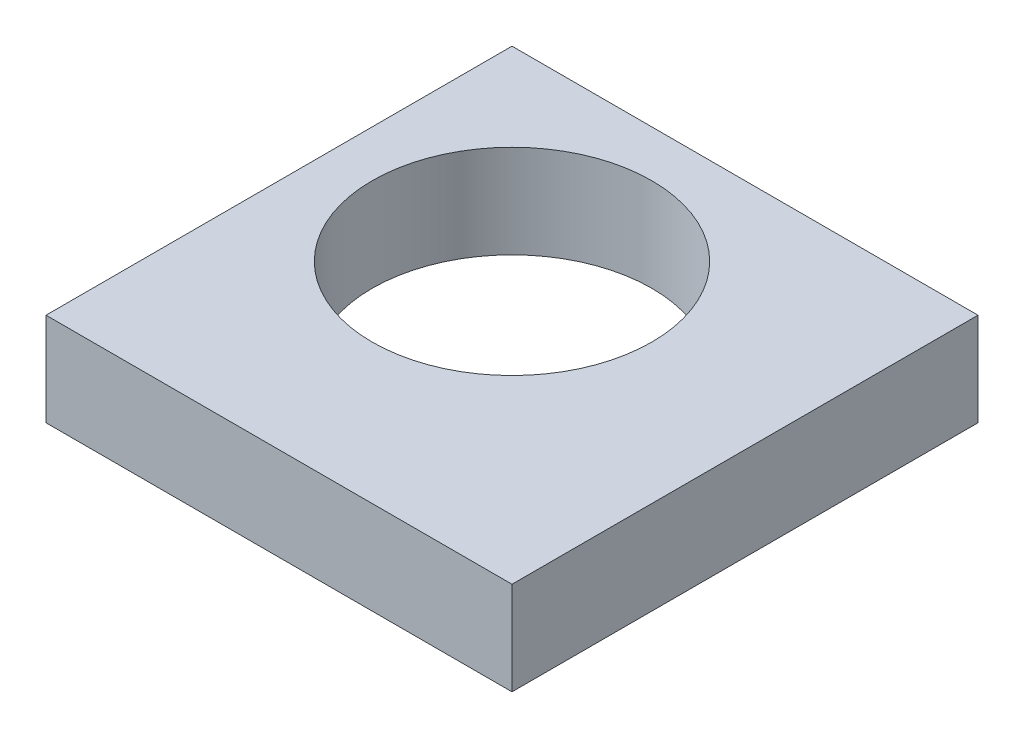
ISO-10303-21;
HEADER;
FILE_DESCRIPTION(('STEP AP214'),'2;1');
FILE_NAME('part.step','',(''),(''),'','','');
FILE_SCHEMA(('AUTOMOTIVE_DESIGN { 1 0 10303 214 1 1 1 1 }'));
ENDSEC;
DATA;
#1=APPLICATION_CONTEXT('core data for automotive mechanical design processes');
#2=APPLICATION_PROTOCOL_DEFINITION('international standard','automotive_design',2000,#1);
#3=PRODUCT_CONTEXT('',#1,'mechanical');
#4=PRODUCT('Part','Part','',(#3));
#5=PRODUCT_RELATED_PRODUCT_CATEGORY('part','',(#4));
#6=PRODUCT_DEFINITION_FORMATION('','',#4);
#7=PRODUCT_DEFINITION_CONTEXT('part definition',#1,'design');
#8=PRODUCT_DEFINITION('design','',#6,#7);
#9=PRODUCT_DEFINITION_SHAPE('','',#8);
#10=(LENGTH_UNIT() NAMED_UNIT(*) SI_UNIT(.MILLI.,.METRE.));
#11=(NAMED_UNIT(*) PLANE_ANGLE_UNIT() SI_UNIT($,.RADIAN.));
#12=(NAMED_UNIT(*) SI_UNIT($,.STERADIAN.) SOLID_ANGLE_UNIT());
#13=UNCERTAINTY_MEASURE_WITH_UNIT(LENGTH_MEASURE(1.E-05),#10,'distance_accuracy_value','');
#14=(GEOMETRIC_REPRESENTATION_CONTEXT(3) GLOBAL_UNCERTAINTY_ASSIGNED_CONTEXT((#13)) GLOBAL_UNIT_ASSIGNED_CONTEXT((#10,
#11,#12)) REPRESENTATION_CONTEXT('',''));
#15=CARTESIAN_POINT('',(0.,0.,0.));
#16=DIRECTION('',(0.,0.,1.));
#17=DIRECTION('',(1.,0.,0.));
#18=AXIS2_PLACEMENT_3D('',#15,#16,#17);
#19=CARTESIAN_POINT('',(-25.,10.,-25.));
#20=DIRECTION('',(1.,0.,0.));
#21=DIRECTION('',(0.,0.,-1.));
#22=AXIS2_PLACEMENT_3D('',#19,#20,#21);
#23=PLANE('',#22);
#24=DIRECTION('',(0.,0.,1.));
#25=VECTOR('',#24,1.);
#26=CARTESIAN_POINT('',(-25.,0.,-25.));
#27=LINE('',#26,#25);
#28=CARTESIAN_POINT('',(-25.,0.,-25.));
#29=VERTEX_POINT('',#28);
#30=CARTESIAN_POINT('',(-25.,0.,25.));
#31=VERTEX_POINT('',#30);
#32=EDGE_CURVE('E100',#29,#31,#27,.T.);
#33=ORIENTED_EDGE('',*,*,#32,.T.);
#34=DIRECTION('',(0.,-1.,0.));
#35=VECTOR('',#34,1.);
#36=CARTESIAN_POINT('',(-25.,10.,25.));
#37=LINE('',#36,#35);
#38=CARTESIAN_POINT('',(-25.,10.,25.));
#39=VERTEX_POINT('',#38);
#40=EDGE_CURVE('E11',#39,#31,#37,.T.);
#41=ORIENTED_EDGE('',*,*,#40,.F.);
#42=DIRECTION('',(0.,0.,1.));
#43=VECTOR('',#42,1.);
#44=CARTESIAN_POINT('',(-25.,10.,-25.));
#45=LINE('',#44,#43);
#46=CARTESIAN_POINT('',(-25.,10.,-25.));
#47=VERTEX_POINT('',#46);
#48=EDGE_CURVE('E88',#47,#39,#45,.T.);
#49=ORIENTED_EDGE('',*,*,#48,.F.);
#50=DIRECTION('',(0.,-1.,0.));
#51=VECTOR('',#50,1.);
#52=CARTESIAN_POINT('',(-25.,10.,-25.));
#53=LINE('',#52,#51);
#54=EDGE_CURVE('E96',#47,#29,#53,.T.);
#55=ORIENTED_EDGE('',*,*,#54,.T.);
#56=EDGE_LOOP('',(#33,#41,#49,#55));
#57=FACE_BOUND('',#56,.T.);
#58=ADVANCED_FACE('F37',(#57),#23,.F.);
#59=CARTESIAN_POINT('',(25.,10.,25.));
#60=DIRECTION('',(0.,0.,-1.));
#61=DIRECTION('',(-1.,0.,0.));
#62=AXIS2_PLACEMENT_3D('',#59,#60,#61);
#63=PLANE('',#62);
#64=DIRECTION('',(1.,0.,0.));
#65=VECTOR('',#64,1.);
#66=CARTESIAN_POINT('',(25.,0.,25.));
#67=LINE('',#66,#65);
#68=CARTESIAN_POINT('',(25.,0.,25.));
#69=VERTEX_POINT('',#68);
#70=EDGE_CURVE('E92',#31,#69,#67,.T.);
#71=ORIENTED_EDGE('',*,*,#70,.T.);
#72=DIRECTION('',(0.,-1.,0.));
#73=VECTOR('',#72,1.);
#74=CARTESIAN_POINT('',(25.,10.,25.));
#75=LINE('',#74,#73);
#76=CARTESIAN_POINT('',(25.,10.,25.));
#77=VERTEX_POINT('',#76);
#78=EDGE_CURVE('E45',#77,#69,#75,.T.);
#79=ORIENTED_EDGE('',*,*,#78,.F.);
#80=DIRECTION('',(1.,0.,0.));
#81=VECTOR('',#80,1.);
#82=CARTESIAN_POINT('',(25.,10.,25.));
#83=LINE('',#82,#81);
#84=EDGE_CURVE('E83',#39,#77,#83,.T.);
#85=ORIENTED_EDGE('',*,*,#84,.F.);
#86=ORIENTED_EDGE('',*,*,#40,.T.);
#87=EDGE_LOOP('',(#71,#79,#85,#86));
#88=FACE_BOUND('',#87,.T.);
#89=ADVANCED_FACE('F91',(#88),#63,.F.);
#90=CARTESIAN_POINT('',(25.,10.,-25.));
#91=DIRECTION('',(-1.,0.,0.));
#92=DIRECTION('',(0.,0.,1.));
#93=AXIS2_PLACEMENT_3D('',#90,#91,#92);
#94=PLANE('',#93);
#95=DIRECTION('',(0.,0.,-1.));
#96=VECTOR('',#95,1.);
#97=CARTESIAN_POINT('',(25.,0.,-25.));
#98=LINE('',#97,#96);
#99=CARTESIAN_POINT('',(25.,0.,-25.));
#100=VERTEX_POINT('',#99);
#101=EDGE_CURVE('E70',#69,#100,#98,.T.);
#102=ORIENTED_EDGE('',*,*,#101,.T.);
#103=DIRECTION('',(0.,-1.,0.));
#104=VECTOR('',#103,1.);
#105=CARTESIAN_POINT('',(25.,10.,-25.));
#106=LINE('',#105,#104);
#107=CARTESIAN_POINT('',(25.,10.,-25.));
#108=VERTEX_POINT('',#107);
#109=EDGE_CURVE('E93',#108,#100,#106,.T.);
#110=ORIENTED_EDGE('',*,*,#109,.F.);
#111=DIRECTION('',(0.,0.,-1.));
#112=VECTOR('',#111,1.);
#113=CARTESIAN_POINT('',(25.,10.,-25.));
#114=LINE('',#113,#112);
#115=EDGE_CURVE('E86',#77,#108,#114,.T.);
#116=ORIENTED_EDGE('',*,*,#115,.F.);
#117=ORIENTED_EDGE('',*,*,#78,.T.);
#118=EDGE_LOOP('',(#102,#110,#116,#117));
#119=FACE_BOUND('',#118,.T.);
#120=ADVANCED_FACE('F94',(#119),#94,.F.);
#121=CARTESIAN_POINT('',(25.,10.,-25.));
#122=DIRECTION('',(0.,0.,1.));
#123=DIRECTION('',(1.,0.,0.));
#124=AXIS2_PLACEMENT_3D('',#121,#122,#123);
#125=PLANE('',#124);
#126=DIRECTION('',(-1.,0.,0.));
#127=VECTOR('',#126,1.);
#128=CARTESIAN_POINT('',(25.,0.,-25.));
#129=LINE('',#128,#127);
#130=EDGE_CURVE('E76',#100,#29,#129,.T.);
#131=ORIENTED_EDGE('',*,*,#130,.T.);
#132=ORIENTED_EDGE('',*,*,#54,.F.);
#133=DIRECTION('',(-1.,0.,0.));
#134=VECTOR('',#133,1.);
#135=CARTESIAN_POINT('',(25.,10.,-25.));
#136=LINE('',#135,#134);
#137=EDGE_CURVE('E53',#108,#47,#136,.T.);
#138=ORIENTED_EDGE('',*,*,#137,.F.);
#139=ORIENTED_EDGE('',*,*,#109,.T.);
#140=EDGE_LOOP('',(#131,#132,#138,#139));
#141=FACE_BOUND('',#140,.T.);
#142=ADVANCED_FACE('F108',(#141),#125,.F.);
#143=CARTESIAN_POINT('',(0.,10.,0.));
#144=DIRECTION('',(0.,-1.,0.));
#145=DIRECTION('',(0.,0.,-1.));
#146=AXIS2_PLACEMENT_3D('',#143,#144,#145);
#147=PLANE('',#146);
#148=CARTESIAN_POINT('',(-5.,10.,-5.));
#149=DIRECTION('',(0.,1.,0.));
#150=DIRECTION('',(0.,0.,1.));
#151=AXIS2_PLACEMENT_3D('',#148,#149,#150);
#152=CIRCLE('',#151,15.);
#153=CARTESIAN_POINT('',(-5.,10.,10.));
#154=VERTEX_POINT('',#153);
#155=EDGE_CURVE('E114',#154,#154,#152,.T.);
#156=ORIENTED_EDGE('',*,*,#155,.F.);
#157=EDGE_LOOP('',(#156));
#158=FACE_BOUND('',#157,.T.);
#159=ORIENTED_EDGE('',*,*,#48,.T.);
#160=ORIENTED_EDGE('',*,*,#84,.T.);
#161=ORIENTED_EDGE('',*,*,#115,.T.);
#162=ORIENTED_EDGE('',*,*,#137,.T.);
#163=EDGE_LOOP('',(#159,#160,#161,#162));
#164=FACE_BOUND('',#163,.T.);
#165=ADVANCED_FACE('F84',(#158,#164),#147,.F.);
#166=CARTESIAN_POINT('',(0.,0.,0.));
#167=DIRECTION('',(0.,-1.,0.));
#168=DIRECTION('',(0.,0.,-1.));
#169=AXIS2_PLACEMENT_3D('',#166,#167,#168);
#170=PLANE('',#169);
#171=CARTESIAN_POINT('',(-5.,0.,-5.));
#172=DIRECTION('',(0.,1.,0.));
#173=DIRECTION('',(0.,0.,1.));
#174=AXIS2_PLACEMENT_3D('',#171,#172,#173);
#175=CIRCLE('',#174,15.);
#176=CARTESIAN_POINT('',(-5.,0.,10.));
#177=VERTEX_POINT('',#176);
#178=EDGE_CURVE('E103',#177,#177,#175,.T.);
#179=ORIENTED_EDGE('',*,*,#178,.T.);
#180=EDGE_LOOP('',(#179));
#181=FACE_BOUND('',#180,.T.);
#182=ORIENTED_EDGE('',*,*,#32,.F.);
#183=ORIENTED_EDGE('',*,*,#130,.F.);
#184=ORIENTED_EDGE('',*,*,#101,.F.);
#185=ORIENTED_EDGE('',*,*,#70,.F.);
#186=EDGE_LOOP('',(#182,#183,#184,#185));
#187=FACE_BOUND('',#186,.T.);
#188=ADVANCED_FACE('F111',(#181,#187),#170,.T.);
#189=CARTESIAN_POINT('',(-5.,0.,-5.));
#190=DIRECTION('',(0.,1.,0.));
#191=DIRECTION('',(0.,0.,1.));
#192=AXIS2_PLACEMENT_3D('',#189,#190,#191);
#193=CYLINDRICAL_SURFACE('',#192,15.);
#194=ORIENTED_EDGE('',*,*,#178,.F.);
#195=EDGE_LOOP('',(#194));
#196=FACE_BOUND('',#195,.T.);
#197=ORIENTED_EDGE('',*,*,#155,.T.);
#198=EDGE_LOOP('',(#197));
#199=FACE_BOUND('',#198,.T.);
#200=ADVANCED_FACE('F121',(#196,#199),#193,.F.);
#201=CLOSED_SHELL('',(#58,#89,#120,#142,#165,#188,#200));
#202=MANIFOLD_SOLID_BREP('B2',#201);
#203=ADVANCED_BREP_SHAPE_REPRESENTATION('',(#18,#202),#14);
#204=SHAPE_DEFINITION_REPRESENTATION(#9,#203);
ENDSEC;
END-ISO-10303-21;
